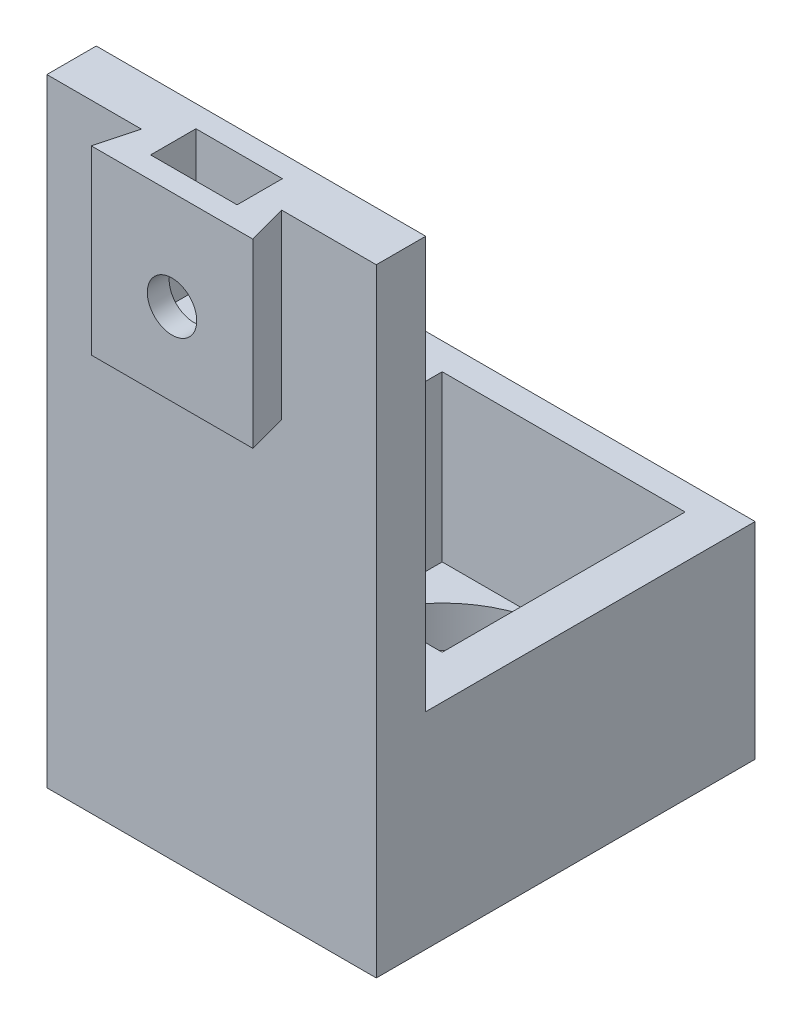
ISO-10303-21;
HEADER;
FILE_DESCRIPTION(('STEP AP214'),'2;1');
FILE_NAME('part.step','',(''),(''),'','','');
FILE_SCHEMA(('AUTOMOTIVE_DESIGN { 1 0 10303 214 1 1 1 1 }'));
ENDSEC;
DATA;
#1=APPLICATION_CONTEXT('core data for automotive mechanical design processes');
#2=APPLICATION_PROTOCOL_DEFINITION('international standard','automotive_design',2000,#1);
#3=PRODUCT_CONTEXT('',#1,'mechanical');
#4=PRODUCT('Part','Part','',(#3));
#5=PRODUCT_RELATED_PRODUCT_CATEGORY('part','',(#4));
#6=PRODUCT_DEFINITION_FORMATION('','',#4);
#7=PRODUCT_DEFINITION_CONTEXT('part definition',#1,'design');
#8=PRODUCT_DEFINITION('design','',#6,#7);
#9=PRODUCT_DEFINITION_SHAPE('','',#8);
#10=(LENGTH_UNIT() NAMED_UNIT(*) SI_UNIT(.MILLI.,.METRE.));
#11=(NAMED_UNIT(*) PLANE_ANGLE_UNIT() SI_UNIT($,.RADIAN.));
#12=(NAMED_UNIT(*) SI_UNIT($,.STERADIAN.) SOLID_ANGLE_UNIT());
#13=UNCERTAINTY_MEASURE_WITH_UNIT(LENGTH_MEASURE(1.E-05),#10,'distance_accuracy_value','');
#14=(GEOMETRIC_REPRESENTATION_CONTEXT(3) GLOBAL_UNCERTAINTY_ASSIGNED_CONTEXT((#13)) GLOBAL_UNIT_ASSIGNED_CONTEXT((#10,
#11,#12)) REPRESENTATION_CONTEXT('',''));
#15=CARTESIAN_POINT('',(0.,0.,0.));
#16=DIRECTION('',(0.,0.,1.));
#17=DIRECTION('',(1.,0.,0.));
#18=AXIS2_PLACEMENT_3D('',#15,#16,#17);
#19=CARTESIAN_POINT('',(0.,5.,0.));
#20=DIRECTION('',(0.,-1.,0.));
#21=DIRECTION('',(0.,0.,-1.));
#22=AXIS2_PLACEMENT_3D('',#19,#20,#21);
#23=PLANE('',#22);
#24=CARTESIAN_POINT('',(0.,5.,-22.));
#25=DIRECTION('',(0.,1.,0.));
#26=DIRECTION('',(0.,0.,1.));
#27=AXIS2_PLACEMENT_3D('',#24,#25,#26);
#28=CIRCLE('',#27,14.75);
#29=CARTESIAN_POINT('',(0.,5.,-7.25000000000001));
#30=VERTEX_POINT('',#29);
#31=CARTESIAN_POINT('',(14.75,5.,-22.));
#32=VERTEX_POINT('',#31);
#33=EDGE_CURVE('E171',#30,#32,#28,.T.);
#34=ORIENTED_EDGE('',*,*,#33,.F.);
#35=DIRECTION('',(1.,0.,0.));
#36=VECTOR('',#35,1.);
#37=CARTESIAN_POINT('',(-14.75,5.,-7.25));
#38=LINE('',#37,#36);
#39=CARTESIAN_POINT('',(14.75,5.,-7.25));
#40=VERTEX_POINT('',#39);
#41=EDGE_CURVE('E180',#30,#40,#38,.T.);
#42=ORIENTED_EDGE('',*,*,#41,.T.);
#43=DIRECTION('',(0.,0.,-1.));
#44=VECTOR('',#43,1.);
#45=CARTESIAN_POINT('',(14.75,5.,-7.25));
#46=LINE('',#45,#44);
#47=EDGE_CURVE('E183',#40,#32,#46,.T.);
#48=ORIENTED_EDGE('',*,*,#47,.T.);
#49=EDGE_LOOP('',(#34,#42,#48));
#50=FACE_BOUND('',#49,.T.);
#51=ADVANCED_FACE('F32',(#50),#23,.F.);
#52=CARTESIAN_POINT('',(0.,5.,-36.75));
#53=VERTEX_POINT('',#52);
#54=EDGE_CURVE('E185',#32,#53,#28,.T.);
#55=ORIENTED_EDGE('',*,*,#54,.F.);
#56=CARTESIAN_POINT('',(14.75,5.,-36.75));
#57=VERTEX_POINT('',#56);
#58=EDGE_CURVE('E196',#32,#57,#46,.T.);
#59=ORIENTED_EDGE('',*,*,#58,.T.);
#60=DIRECTION('',(-1.,0.,0.));
#61=VECTOR('',#60,1.);
#62=CARTESIAN_POINT('',(-14.75,5.,-36.75));
#63=LINE('',#62,#61);
#64=EDGE_CURVE('E201',#57,#53,#63,.T.);
#65=ORIENTED_EDGE('',*,*,#64,.T.);
#66=EDGE_LOOP('',(#55,#59,#65));
#67=FACE_BOUND('',#66,.T.);
#68=ADVANCED_FACE('F390',(#67),#23,.F.);
#69=CARTESIAN_POINT('',(-14.75,5.,-22.));
#70=VERTEX_POINT('',#69);
#71=EDGE_CURVE('E48',#53,#70,#28,.T.);
#72=ORIENTED_EDGE('',*,*,#71,.F.);
#73=CARTESIAN_POINT('',(-14.75,5.,-36.75));
#74=VERTEX_POINT('',#73);
#75=EDGE_CURVE('E200',#53,#74,#63,.T.);
#76=ORIENTED_EDGE('',*,*,#75,.T.);
#77=DIRECTION('',(0.,0.,1.));
#78=VECTOR('',#77,1.);
#79=CARTESIAN_POINT('',(-14.75,5.,-7.25));
#80=LINE('',#79,#78);
#81=EDGE_CURVE('E192',#74,#70,#80,.T.);
#82=ORIENTED_EDGE('',*,*,#81,.T.);
#83=EDGE_LOOP('',(#72,#76,#82));
#84=FACE_BOUND('',#83,.T.);
#85=ADVANCED_FACE('F395',(#84),#23,.F.);
#86=CARTESIAN_POINT('',(0.,0.,0.));
#87=DIRECTION('',(0.,0.,1.));
#88=DIRECTION('',(1.,0.,0.));
#89=AXIS2_PLACEMENT_3D('',#86,#87,#88);
#90=PLANE('',#89);
#91=CARTESIAN_POINT('',(0.,63.,0.));
#92=DIRECTION('',(0.,0.,1.));
#93=DIRECTION('',(1.,0.,0.));
#94=AXIS2_PLACEMENT_3D('',#91,#92,#93);
#95=CIRCLE('',#94,3.);
#96=CARTESIAN_POINT('',(3.00000000000001,63.,0.));
#97=VERTEX_POINT('',#96);
#98=EDGE_CURVE('E240',#97,#97,#95,.T.);
#99=ORIENTED_EDGE('',*,*,#98,.T.);
#100=EDGE_LOOP('',(#99));
#101=FACE_BOUND('',#100,.T.);
#102=DIRECTION('',(1.,0.,0.));
#103=VECTOR('',#102,1.);
#104=CARTESIAN_POINT('',(20.,25.,0.));
#105=LINE('',#104,#103);
#106=CARTESIAN_POINT('',(-20.,25.,0.));
#107=VERTEX_POINT('',#106);
#108=CARTESIAN_POINT('',(20.,25.,0.));
#109=VERTEX_POINT('',#108);
#110=EDGE_CURVE('E216',#107,#109,#105,.T.);
#111=ORIENTED_EDGE('',*,*,#110,.F.);
#112=DIRECTION('',(0.,-1.,0.));
#113=VECTOR('',#112,1.);
#114=CARTESIAN_POINT('',(-20.,0.,0.));
#115=LINE('',#114,#113);
#116=CARTESIAN_POINT('',(-20.,75.,0.));
#117=VERTEX_POINT('',#116);
#118=EDGE_CURVE('E315',#117,#107,#115,.T.);
#119=ORIENTED_EDGE('',*,*,#118,.F.);
#120=DIRECTION('',(-1.,0.,0.));
#121=VECTOR('',#120,1.);
#122=CARTESIAN_POINT('',(20.,75.,0.));
#123=LINE('',#122,#121);
#124=CARTESIAN_POINT('',(20.,75.,0.));
#125=VERTEX_POINT('',#124);
#126=EDGE_CURVE('E325',#125,#117,#123,.T.);
#127=ORIENTED_EDGE('',*,*,#126,.F.);
#128=DIRECTION('',(0.,1.,0.));
#129=VECTOR('',#128,1.);
#130=CARTESIAN_POINT('',(20.,0.,0.));
#131=LINE('',#130,#129);
#132=EDGE_CURVE('E304',#109,#125,#131,.T.);
#133=ORIENTED_EDGE('',*,*,#132,.F.);
#134=EDGE_LOOP('',(#111,#119,#127,#133));
#135=FACE_BOUND('',#134,.T.);
#136=ADVANCED_FACE('F344',(#101,#135),#90,.F.);
#137=CARTESIAN_POINT('',(20.,0.,6.));
#138=DIRECTION('',(-1.,0.,0.));
#139=DIRECTION('',(0.,0.,1.));
#140=AXIS2_PLACEMENT_3D('',#137,#138,#139);
#141=PLANE('',#140);
#142=DIRECTION('',(0.,0.,-1.));
#143=VECTOR('',#142,1.);
#144=CARTESIAN_POINT('',(20.,0.,6.));
#145=LINE('',#144,#143);
#146=CARTESIAN_POINT('',(20.,0.,6.));
#147=VERTEX_POINT('',#146);
#148=CARTESIAN_POINT('',(20.,0.,-40.));
#149=VERTEX_POINT('',#148);
#150=EDGE_CURVE('E323',#147,#149,#145,.T.);
#151=ORIENTED_EDGE('',*,*,#150,.T.);
#152=DIRECTION('',(0.,-1.,0.));
#153=VECTOR('',#152,1.);
#154=CARTESIAN_POINT('',(20.,0.,-40.));
#155=LINE('',#154,#153);
#156=CARTESIAN_POINT('',(20.,25.,-40.));
#157=VERTEX_POINT('',#156);
#158=EDGE_CURVE('E221',#157,#149,#155,.T.);
#159=ORIENTED_EDGE('',*,*,#158,.F.);
#160=DIRECTION('',(0.,0.,1.));
#161=VECTOR('',#160,1.);
#162=CARTESIAN_POINT('',(20.,25.,-40.));
#163=LINE('',#162,#161);
#164=EDGE_CURVE('E231',#157,#109,#163,.T.);
#165=ORIENTED_EDGE('',*,*,#164,.T.);
#166=ORIENTED_EDGE('',*,*,#132,.T.);
#167=DIRECTION('',(0.,0.,-1.));
#168=VECTOR('',#167,1.);
#169=CARTESIAN_POINT('',(20.,75.,6.));
#170=LINE('',#169,#168);
#171=CARTESIAN_POINT('',(20.,75.,6.));
#172=VERTEX_POINT('',#171);
#173=EDGE_CURVE('E11',#172,#125,#170,.T.);
#174=ORIENTED_EDGE('',*,*,#173,.F.);
#175=DIRECTION('',(0.,1.,0.));
#176=VECTOR('',#175,1.);
#177=CARTESIAN_POINT('',(20.,0.,6.));
#178=LINE('',#177,#176);
#179=EDGE_CURVE('E311',#147,#172,#178,.T.);
#180=ORIENTED_EDGE('',*,*,#179,.F.);
#181=EDGE_LOOP('',(#151,#159,#165,#166,#174,#180));
#182=FACE_BOUND('',#181,.T.);
#183=ADVANCED_FACE('F34',(#182),#141,.F.);
#184=CARTESIAN_POINT('',(20.,75.,6.));
#185=DIRECTION('',(0.,-1.,0.));
#186=DIRECTION('',(0.,0.,-1.));
#187=AXIS2_PLACEMENT_3D('',#184,#185,#186);
#188=PLANE('',#187);
#189=DIRECTION('',(1.,0.,0.));
#190=VECTOR('',#189,1.);
#191=CARTESIAN_POINT('',(-5.25,75.,8.15));
#192=LINE('',#191,#190);
#193=CARTESIAN_POINT('',(-5.25,75.,8.15));
#194=VERTEX_POINT('',#193);
#195=CARTESIAN_POINT('',(5.25,75.,8.15));
#196=VERTEX_POINT('',#195);
#197=EDGE_CURVE('E264',#194,#196,#192,.T.);
#198=ORIENTED_EDGE('',*,*,#197,.F.);
#199=DIRECTION('',(0.,0.,1.));
#200=VECTOR('',#199,1.);
#201=CARTESIAN_POINT('',(-5.25,75.,2.65));
#202=LINE('',#201,#200);
#203=CARTESIAN_POINT('',(-5.25,75.,2.65));
#204=VERTEX_POINT('',#203);
#205=EDGE_CURVE('E248',#204,#194,#202,.T.);
#206=ORIENTED_EDGE('',*,*,#205,.F.);
#207=DIRECTION('',(-1.,0.,0.));
#208=VECTOR('',#207,1.);
#209=CARTESIAN_POINT('',(-5.25,75.,2.65));
#210=LINE('',#209,#208);
#211=CARTESIAN_POINT('',(5.25,75.,2.65));
#212=VERTEX_POINT('',#211);
#213=EDGE_CURVE('E253',#212,#204,#210,.T.);
#214=ORIENTED_EDGE('',*,*,#213,.F.);
#215=DIRECTION('',(0.,0.,-1.));
#216=VECTOR('',#215,1.);
#217=CARTESIAN_POINT('',(5.25,75.,2.65));
#218=LINE('',#217,#216);
#219=EDGE_CURVE('E267',#196,#212,#218,.T.);
#220=ORIENTED_EDGE('',*,*,#219,.F.);
#221=EDGE_LOOP('',(#198,#206,#214,#220));
#222=FACE_BOUND('',#221,.T.);
#223=ORIENTED_EDGE('',*,*,#126,.T.);
#224=DIRECTION('',(0.,0.,-1.));
#225=VECTOR('',#224,1.);
#226=CARTESIAN_POINT('',(-20.,75.,6.));
#227=LINE('',#226,#225);
#228=CARTESIAN_POINT('',(-20.,75.,6.));
#229=VERTEX_POINT('',#228);
#230=EDGE_CURVE('E41',#229,#117,#227,.T.);
#231=ORIENTED_EDGE('',*,*,#230,.F.);
#232=DIRECTION('',(-1.,0.,0.));
#233=VECTOR('',#232,1.);
#234=CARTESIAN_POINT('',(20.,75.,6.));
#235=LINE('',#234,#233);
#236=CARTESIAN_POINT('',(-8.51384387633063,75.,6.));
#237=VERTEX_POINT('',#236);
#238=EDGE_CURVE('E314',#237,#229,#235,.T.);
#239=ORIENTED_EDGE('',*,*,#238,.F.);
#240=DIRECTION('',(-0.258819045102517,0.,0.965925826289069));
#241=VECTOR('',#240,1.);
#242=CARTESIAN_POINT('',(-8.51384387633063,75.,6.));
#243=LINE('',#242,#241);
#244=CARTESIAN_POINT('',(-9.8,75.,10.8));
#245=VERTEX_POINT('',#244);
#246=EDGE_CURVE('E297',#237,#245,#243,.T.);
#247=ORIENTED_EDGE('',*,*,#246,.T.);
#248=DIRECTION('',(1.,0.,0.));
#249=VECTOR('',#248,1.);
#250=CARTESIAN_POINT('',(-9.8,75.,10.8));
#251=LINE('',#250,#249);
#252=CARTESIAN_POINT('',(9.8,75.,10.8));
#253=VERTEX_POINT('',#252);
#254=EDGE_CURVE('E285',#245,#253,#251,.T.);
#255=ORIENTED_EDGE('',*,*,#254,.T.);
#256=DIRECTION('',(-0.258819045102517,0.,-0.965925826289069));
#257=VECTOR('',#256,1.);
#258=CARTESIAN_POINT('',(8.51384387633063,75.,5.99999999999999));
#259=LINE('',#258,#257);
#260=CARTESIAN_POINT('',(8.51384387633063,75.,5.99999999999999));
#261=VERTEX_POINT('',#260);
#262=EDGE_CURVE('E274',#253,#261,#259,.T.);
#263=ORIENTED_EDGE('',*,*,#262,.T.);
#264=EDGE_CURVE('E316',#172,#261,#235,.T.);
#265=ORIENTED_EDGE('',*,*,#264,.F.);
#266=ORIENTED_EDGE('',*,*,#173,.T.);
#267=EDGE_LOOP('',(#223,#231,#239,#247,#255,#263,#265,#266));
#268=FACE_BOUND('',#267,.T.);
#269=ADVANCED_FACE('F364',(#222,#268),#188,.F.);
#270=CARTESIAN_POINT('',(-20.,0.,6.));
#271=DIRECTION('',(1.,0.,0.));
#272=DIRECTION('',(0.,1.,0.));
#273=AXIS2_PLACEMENT_3D('',#270,#271,#272);
#274=PLANE('',#273);
#275=ORIENTED_EDGE('',*,*,#118,.T.);
#276=DIRECTION('',(0.,0.,1.));
#277=VECTOR('',#276,1.);
#278=CARTESIAN_POINT('',(-20.,25.,-40.));
#279=LINE('',#278,#277);
#280=CARTESIAN_POINT('',(-20.,25.,-40.));
#281=VERTEX_POINT('',#280);
#282=EDGE_CURVE('E236',#281,#107,#279,.T.);
#283=ORIENTED_EDGE('',*,*,#282,.F.);
#284=DIRECTION('',(0.,1.,0.));
#285=VECTOR('',#284,1.);
#286=CARTESIAN_POINT('',(-20.,0.,-40.));
#287=LINE('',#286,#285);
#288=CARTESIAN_POINT('',(-20.,0.,-40.));
#289=VERTEX_POINT('',#288);
#290=EDGE_CURVE('E227',#289,#281,#287,.T.);
#291=ORIENTED_EDGE('',*,*,#290,.F.);
#292=DIRECTION('',(0.,0.,-1.));
#293=VECTOR('',#292,1.);
#294=CARTESIAN_POINT('',(-20.,0.,6.));
#295=LINE('',#294,#293);
#296=CARTESIAN_POINT('',(-20.,0.,6.));
#297=VERTEX_POINT('',#296);
#298=EDGE_CURVE('E330',#297,#289,#295,.T.);
#299=ORIENTED_EDGE('',*,*,#298,.F.);
#300=DIRECTION('',(0.,-1.,0.));
#301=VECTOR('',#300,1.);
#302=CARTESIAN_POINT('',(-20.,0.,6.));
#303=LINE('',#302,#301);
#304=EDGE_CURVE('E319',#229,#297,#303,.T.);
#305=ORIENTED_EDGE('',*,*,#304,.F.);
#306=ORIENTED_EDGE('',*,*,#230,.T.);
#307=EDGE_LOOP('',(#275,#283,#291,#299,#305,#306));
#308=FACE_BOUND('',#307,.T.);
#309=ADVANCED_FACE('F337',(#308),#274,.F.);
#310=CARTESIAN_POINT('',(-20.,0.,6.));
#311=DIRECTION('',(0.,1.,0.));
#312=DIRECTION('',(-1.,0.,0.));
#313=AXIS2_PLACEMENT_3D('',#310,#311,#312);
#314=PLANE('',#313);
#315=CARTESIAN_POINT('',(0.,0.,-22.));
#316=DIRECTION('',(0.,1.,0.));
#317=DIRECTION('',(0.,0.,1.));
#318=AXIS2_PLACEMENT_3D('',#315,#316,#317);
#319=CIRCLE('',#318,14.75);
#320=CARTESIAN_POINT('',(0.,0.,-7.25000000000001));
#321=VERTEX_POINT('',#320);
#322=EDGE_CURVE('E184',#321,#321,#319,.T.);
#323=ORIENTED_EDGE('',*,*,#322,.T.);
#324=EDGE_LOOP('',(#323));
#325=FACE_BOUND('',#324,.T.);
#326=ORIENTED_EDGE('',*,*,#298,.T.);
#327=DIRECTION('',(-1.,0.,0.));
#328=VECTOR('',#327,1.);
#329=CARTESIAN_POINT('',(20.,0.,-40.));
#330=LINE('',#329,#328);
#331=EDGE_CURVE('E224',#149,#289,#330,.T.);
#332=ORIENTED_EDGE('',*,*,#331,.F.);
#333=ORIENTED_EDGE('',*,*,#150,.F.);
#334=DIRECTION('',(1.,0.,0.));
#335=VECTOR('',#334,1.);
#336=CARTESIAN_POINT('',(-20.,0.,6.));
#337=LINE('',#336,#335);
#338=EDGE_CURVE('E321',#297,#147,#337,.T.);
#339=ORIENTED_EDGE('',*,*,#338,.F.);
#340=EDGE_LOOP('',(#326,#332,#333,#339));
#341=FACE_BOUND('',#340,.T.);
#342=ADVANCED_FACE('F360',(#325,#341),#314,.F.);
#343=CARTESIAN_POINT('',(0.,0.,6.));
#344=DIRECTION('',(0.,0.,1.));
#345=DIRECTION('',(1.,0.,0.));
#346=AXIS2_PLACEMENT_3D('',#343,#344,#345);
#347=PLANE('',#346);
#348=DIRECTION('',(0.,1.,0.));
#349=VECTOR('',#348,1.);
#350=CARTESIAN_POINT('',(8.51384387633063,53.,5.99999999999999));
#351=LINE('',#350,#349);
#352=CARTESIAN_POINT('',(8.51384387633063,53.,5.99999999999999));
#353=VERTEX_POINT('',#352);
#354=EDGE_CURVE('E294',#353,#261,#351,.T.);
#355=ORIENTED_EDGE('',*,*,#354,.F.);
#356=DIRECTION('',(-1.,0.,0.));
#357=VECTOR('',#356,1.);
#358=CARTESIAN_POINT('',(8.51384387633063,53.,5.99999999999999));
#359=LINE('',#358,#357);
#360=CARTESIAN_POINT('',(-8.51384387633063,53.,6.));
#361=VERTEX_POINT('',#360);
#362=EDGE_CURVE('E284',#353,#361,#359,.T.);
#363=ORIENTED_EDGE('',*,*,#362,.T.);
#364=DIRECTION('',(0.,1.,0.));
#365=VECTOR('',#364,1.);
#366=CARTESIAN_POINT('',(-8.51384387633063,53.,6.));
#367=LINE('',#366,#365);
#368=EDGE_CURVE('E307',#361,#237,#367,.T.);
#369=ORIENTED_EDGE('',*,*,#368,.T.);
#370=ORIENTED_EDGE('',*,*,#238,.T.);
#371=ORIENTED_EDGE('',*,*,#304,.T.);
#372=ORIENTED_EDGE('',*,*,#338,.T.);
#373=ORIENTED_EDGE('',*,*,#179,.T.);
#374=ORIENTED_EDGE('',*,*,#264,.T.);
#375=EDGE_LOOP('',(#355,#363,#369,#370,#371,#372,#373,#374));
#376=FACE_BOUND('',#375,.T.);
#377=ADVANCED_FACE('F363',(#376),#347,.T.);
#378=CARTESIAN_POINT('',(8.51384387633063,53.,5.99999999999999));
#379=DIRECTION('',(0.965925826289069,0.,-0.258819045102517));
#380=DIRECTION('',(-0.258819045102517,0.,-0.965925826289069));
#381=AXIS2_PLACEMENT_3D('',#378,#379,#380);
#382=PLANE('',#381);
#383=ORIENTED_EDGE('',*,*,#262,.F.);
#384=DIRECTION('',(0.,1.,0.));
#385=VECTOR('',#384,1.);
#386=CARTESIAN_POINT('',(9.8,53.,10.8));
#387=LINE('',#386,#385);
#388=CARTESIAN_POINT('',(9.8,53.,10.8));
#389=VERTEX_POINT('',#388);
#390=EDGE_CURVE('E302',#389,#253,#387,.T.);
#391=ORIENTED_EDGE('',*,*,#390,.F.);
#392=DIRECTION('',(-0.258819045102517,0.,-0.965925826289069));
#393=VECTOR('',#392,1.);
#394=CARTESIAN_POINT('',(8.51384387633063,53.,5.99999999999999));
#395=LINE('',#394,#393);
#396=EDGE_CURVE('E281',#389,#353,#395,.T.);
#397=ORIENTED_EDGE('',*,*,#396,.T.);
#398=ORIENTED_EDGE('',*,*,#354,.T.);
#399=EDGE_LOOP('',(#383,#391,#397,#398));
#400=FACE_BOUND('',#399,.T.);
#401=ADVANCED_FACE('F373',(#400),#382,.T.);
#402=CARTESIAN_POINT('',(-9.8,53.,10.8));
#403=DIRECTION('',(0.,0.,1.));
#404=DIRECTION('',(1.,0.,0.));
#405=AXIS2_PLACEMENT_3D('',#402,#403,#404);
#406=PLANE('',#405);
#407=CARTESIAN_POINT('',(0.,63.,10.8));
#408=DIRECTION('',(0.,0.,1.));
#409=DIRECTION('',(1.,0.,0.));
#410=AXIS2_PLACEMENT_3D('',#407,#408,#409);
#411=CIRCLE('',#410,3.);
#412=CARTESIAN_POINT('',(3.00000000000001,63.,10.8));
#413=VERTEX_POINT('',#412);
#414=EDGE_CURVE('E239',#413,#413,#411,.T.);
#415=ORIENTED_EDGE('',*,*,#414,.F.);
#416=EDGE_LOOP('',(#415));
#417=FACE_BOUND('',#416,.T.);
#418=ORIENTED_EDGE('',*,*,#254,.F.);
#419=DIRECTION('',(0.,1.,0.));
#420=VECTOR('',#419,1.);
#421=CARTESIAN_POINT('',(-9.8,53.,10.8));
#422=LINE('',#421,#420);
#423=CARTESIAN_POINT('',(-9.8,53.,10.8));
#424=VERTEX_POINT('',#423);
#425=EDGE_CURVE('E305',#424,#245,#422,.T.);
#426=ORIENTED_EDGE('',*,*,#425,.F.);
#427=DIRECTION('',(1.,0.,0.));
#428=VECTOR('',#427,1.);
#429=CARTESIAN_POINT('',(-9.8,53.,10.8));
#430=LINE('',#429,#428);
#431=EDGE_CURVE('E291',#424,#389,#430,.T.);
#432=ORIENTED_EDGE('',*,*,#431,.T.);
#433=ORIENTED_EDGE('',*,*,#390,.T.);
#434=EDGE_LOOP('',(#418,#426,#432,#433));
#435=FACE_BOUND('',#434,.T.);
#436=ADVANCED_FACE('F368',(#417,#435),#406,.T.);
#437=CARTESIAN_POINT('',(-8.51384387633063,53.,6.));
#438=DIRECTION('',(-0.965925826289069,0.,-0.258819045102517));
#439=DIRECTION('',(-0.258819045102517,0.,0.965925826289069));
#440=AXIS2_PLACEMENT_3D('',#437,#438,#439);
#441=PLANE('',#440);
#442=ORIENTED_EDGE('',*,*,#246,.F.);
#443=ORIENTED_EDGE('',*,*,#368,.F.);
#444=DIRECTION('',(-0.258819045102517,0.,0.965925826289069));
#445=VECTOR('',#444,1.);
#446=CARTESIAN_POINT('',(-8.51384387633063,53.,6.));
#447=LINE('',#446,#445);
#448=EDGE_CURVE('E288',#361,#424,#447,.T.);
#449=ORIENTED_EDGE('',*,*,#448,.T.);
#450=ORIENTED_EDGE('',*,*,#425,.T.);
#451=EDGE_LOOP('',(#442,#443,#449,#450));
#452=FACE_BOUND('',#451,.T.);
#453=ADVANCED_FACE('F377',(#452),#441,.T.);
#454=CARTESIAN_POINT('',(0.,53.,0.));
#455=DIRECTION('',(0.,1.,0.));
#456=DIRECTION('',(0.,0.,1.));
#457=AXIS2_PLACEMENT_3D('',#454,#455,#456);
#458=PLANE('',#457);
#459=ORIENTED_EDGE('',*,*,#396,.F.);
#460=ORIENTED_EDGE('',*,*,#431,.F.);
#461=ORIENTED_EDGE('',*,*,#448,.F.);
#462=ORIENTED_EDGE('',*,*,#362,.F.);
#463=EDGE_LOOP('',(#459,#460,#461,#462));
#464=FACE_BOUND('',#463,.T.);
#465=ADVANCED_FACE('F376',(#464),#458,.F.);
#466=CARTESIAN_POINT('',(-5.25,58.,2.65));
#467=DIRECTION('',(-1.,0.,0.));
#468=DIRECTION('',(0.,0.,1.));
#469=AXIS2_PLACEMENT_3D('',#466,#467,#468);
#470=PLANE('',#469);
#471=ORIENTED_EDGE('',*,*,#205,.T.);
#472=DIRECTION('',(0.,1.,0.));
#473=VECTOR('',#472,1.);
#474=CARTESIAN_POINT('',(-5.25,58.,8.15));
#475=LINE('',#474,#473);
#476=CARTESIAN_POINT('',(-5.25,58.,8.15));
#477=VERTEX_POINT('',#476);
#478=EDGE_CURVE('E262',#477,#194,#475,.T.);
#479=ORIENTED_EDGE('',*,*,#478,.F.);
#480=DIRECTION('',(0.,0.,1.));
#481=VECTOR('',#480,1.);
#482=CARTESIAN_POINT('',(-5.25,58.,2.65));
#483=LINE('',#482,#481);
#484=CARTESIAN_POINT('',(-5.25,58.,2.65));
#485=VERTEX_POINT('',#484);
#486=EDGE_CURVE('E249',#485,#477,#483,.T.);
#487=ORIENTED_EDGE('',*,*,#486,.F.);
#488=DIRECTION('',(0.,1.,0.));
#489=VECTOR('',#488,1.);
#490=CARTESIAN_POINT('',(-5.25,58.,2.65));
#491=LINE('',#490,#489);
#492=EDGE_CURVE('E272',#485,#204,#491,.T.);
#493=ORIENTED_EDGE('',*,*,#492,.T.);
#494=EDGE_LOOP('',(#471,#479,#487,#493));
#495=FACE_BOUND('',#494,.T.);
#496=ADVANCED_FACE('F384',(#495),#470,.F.);
#497=CARTESIAN_POINT('',(-5.25,58.,2.65));
#498=DIRECTION('',(0.,0.,-1.));
#499=DIRECTION('',(-1.,0.,0.));
#500=AXIS2_PLACEMENT_3D('',#497,#498,#499);
#501=PLANE('',#500);
#502=CARTESIAN_POINT('',(0.,63.,2.65));
#503=DIRECTION('',(0.,0.,-1.));
#504=DIRECTION('',(-1.,0.,0.));
#505=AXIS2_PLACEMENT_3D('',#502,#503,#504);
#506=CIRCLE('',#505,3.);
#507=CARTESIAN_POINT('',(-2.99999999999999,63.,2.65));
#508=VERTEX_POINT('',#507);
#509=EDGE_CURVE('E245',#508,#508,#506,.T.);
#510=ORIENTED_EDGE('',*,*,#509,.T.);
#511=EDGE_LOOP('',(#510));
#512=FACE_BOUND('',#511,.T.);
#513=ORIENTED_EDGE('',*,*,#213,.T.);
#514=ORIENTED_EDGE('',*,*,#492,.F.);
#515=DIRECTION('',(-1.,0.,0.));
#516=VECTOR('',#515,1.);
#517=CARTESIAN_POINT('',(-5.25,58.,2.65));
#518=LINE('',#517,#516);
#519=CARTESIAN_POINT('',(5.25,58.,2.65));
#520=VERTEX_POINT('',#519);
#521=EDGE_CURVE('E259',#520,#485,#518,.T.);
#522=ORIENTED_EDGE('',*,*,#521,.F.);
#523=DIRECTION('',(0.,1.,0.));
#524=VECTOR('',#523,1.);
#525=CARTESIAN_POINT('',(5.25,58.,2.65));
#526=LINE('',#525,#524);
#527=EDGE_CURVE('E275',#520,#212,#526,.T.);
#528=ORIENTED_EDGE('',*,*,#527,.T.);
#529=EDGE_LOOP('',(#513,#514,#522,#528));
#530=FACE_BOUND('',#529,.T.);
#531=ADVANCED_FACE('F450',(#512,#530),#501,.F.);
#532=CARTESIAN_POINT('',(5.25,58.,2.65));
#533=DIRECTION('',(1.,0.,0.));
#534=DIRECTION('',(0.,0.,-1.));
#535=AXIS2_PLACEMENT_3D('',#532,#533,#534);
#536=PLANE('',#535);
#537=ORIENTED_EDGE('',*,*,#219,.T.);
#538=ORIENTED_EDGE('',*,*,#527,.F.);
#539=DIRECTION('',(0.,0.,-1.));
#540=VECTOR('',#539,1.);
#541=CARTESIAN_POINT('',(5.25,58.,2.65));
#542=LINE('',#541,#540);
#543=CARTESIAN_POINT('',(5.25,58.,8.15));
#544=VERTEX_POINT('',#543);
#545=EDGE_CURVE('E256',#544,#520,#542,.T.);
#546=ORIENTED_EDGE('',*,*,#545,.F.);
#547=DIRECTION('',(0.,1.,0.));
#548=VECTOR('',#547,1.);
#549=CARTESIAN_POINT('',(5.25,58.,8.15));
#550=LINE('',#549,#548);
#551=EDGE_CURVE('E277',#544,#196,#550,.T.);
#552=ORIENTED_EDGE('',*,*,#551,.T.);
#553=EDGE_LOOP('',(#537,#538,#546,#552));
#554=FACE_BOUND('',#553,.T.);
#555=ADVANCED_FACE('F453',(#554),#536,.F.);
#556=CARTESIAN_POINT('',(-5.25,58.,8.15));
#557=DIRECTION('',(0.,0.,1.));
#558=DIRECTION('',(1.,0.,0.));
#559=AXIS2_PLACEMENT_3D('',#556,#557,#558);
#560=PLANE('',#559);
#561=CARTESIAN_POINT('',(0.,63.,8.15));
#562=DIRECTION('',(0.,0.,1.));
#563=DIRECTION('',(1.,0.,0.));
#564=AXIS2_PLACEMENT_3D('',#561,#562,#563);
#565=CIRCLE('',#564,3.);
#566=CARTESIAN_POINT('',(3.00000000000001,63.,8.15));
#567=VERTEX_POINT('',#566);
#568=EDGE_CURVE('E36',#567,#567,#565,.T.);
#569=ORIENTED_EDGE('',*,*,#568,.T.);
#570=EDGE_LOOP('',(#569));
#571=FACE_BOUND('',#570,.T.);
#572=ORIENTED_EDGE('',*,*,#197,.T.);
#573=ORIENTED_EDGE('',*,*,#551,.F.);
#574=DIRECTION('',(1.,0.,0.));
#575=VECTOR('',#574,1.);
#576=CARTESIAN_POINT('',(-5.25,58.,8.15));
#577=LINE('',#576,#575);
#578=EDGE_CURVE('E252',#477,#544,#577,.T.);
#579=ORIENTED_EDGE('',*,*,#578,.F.);
#580=ORIENTED_EDGE('',*,*,#478,.T.);
#581=EDGE_LOOP('',(#572,#573,#579,#580));
#582=FACE_BOUND('',#581,.T.);
#583=ADVANCED_FACE('F448',(#571,#582),#560,.F.);
#584=CARTESIAN_POINT('',(0.,58.,0.));
#585=DIRECTION('',(0.,1.,0.));
#586=DIRECTION('',(0.,0.,1.));
#587=AXIS2_PLACEMENT_3D('',#584,#585,#586);
#588=PLANE('',#587);
#589=ORIENTED_EDGE('',*,*,#486,.T.);
#590=ORIENTED_EDGE('',*,*,#578,.T.);
#591=ORIENTED_EDGE('',*,*,#545,.T.);
#592=ORIENTED_EDGE('',*,*,#521,.T.);
#593=EDGE_LOOP('',(#589,#590,#591,#592));
#594=FACE_BOUND('',#593,.T.);
#595=ADVANCED_FACE('F445',(#594),#588,.T.);
#596=CARTESIAN_POINT('',(0.,63.,0.));
#597=DIRECTION('',(0.,0.,1.));
#598=DIRECTION('',(1.,0.,0.));
#599=AXIS2_PLACEMENT_3D('',#596,#597,#598);
#600=CYLINDRICAL_SURFACE('',#599,3.);
#601=ORIENTED_EDGE('',*,*,#414,.T.);
#602=EDGE_LOOP('',(#601));
#603=FACE_BOUND('',#602,.T.);
#604=ORIENTED_EDGE('',*,*,#568,.F.);
#605=EDGE_LOOP('',(#604));
#606=FACE_BOUND('',#605,.T.);
#607=ADVANCED_FACE('F443',(#603,#606),#600,.F.);
#608=ORIENTED_EDGE('',*,*,#98,.F.);
#609=EDGE_LOOP('',(#608));
#610=FACE_BOUND('',#609,.T.);
#611=ORIENTED_EDGE('',*,*,#509,.F.);
#612=EDGE_LOOP('',(#611));
#613=FACE_BOUND('',#612,.T.);
#614=ADVANCED_FACE('F440',(#610,#613),#600,.F.);
#615=CARTESIAN_POINT('',(20.,25.,-40.));
#616=DIRECTION('',(0.,-1.,0.));
#617=DIRECTION('',(0.,0.,-1.));
#618=AXIS2_PLACEMENT_3D('',#615,#616,#617);
#619=PLANE('',#618);
#620=DIRECTION('',(1.,0.,0.));
#621=VECTOR('',#620,1.);
#622=CARTESIAN_POINT('',(-14.75,25.,-7.25));
#623=LINE('',#622,#621);
#624=CARTESIAN_POINT('',(-14.75,25.,-7.25));
#625=VERTEX_POINT('',#624);
#626=CARTESIAN_POINT('',(14.75,25.,-7.25));
#627=VERTEX_POINT('',#626);
#628=EDGE_CURVE('E206',#625,#627,#623,.T.);
#629=ORIENTED_EDGE('',*,*,#628,.F.);
#630=DIRECTION('',(0.,0.,1.));
#631=VECTOR('',#630,1.);
#632=CARTESIAN_POINT('',(-14.75,25.,-7.25));
#633=LINE('',#632,#631);
#634=CARTESIAN_POINT('',(-14.75,25.,-36.75));
#635=VERTEX_POINT('',#634);
#636=EDGE_CURVE('E56',#635,#625,#633,.T.);
#637=ORIENTED_EDGE('',*,*,#636,.F.);
#638=DIRECTION('',(-1.,0.,0.));
#639=VECTOR('',#638,1.);
#640=CARTESIAN_POINT('',(-14.75,25.,-36.75));
#641=LINE('',#640,#639);
#642=CARTESIAN_POINT('',(14.75,25.,-36.75));
#643=VERTEX_POINT('',#642);
#644=EDGE_CURVE('E211',#643,#635,#641,.T.);
#645=ORIENTED_EDGE('',*,*,#644,.F.);
#646=DIRECTION('',(0.,0.,-1.));
#647=VECTOR('',#646,1.);
#648=CARTESIAN_POINT('',(14.75,25.,-7.25));
#649=LINE('',#648,#647);
#650=EDGE_CURVE('E208',#627,#643,#649,.T.);
#651=ORIENTED_EDGE('',*,*,#650,.F.);
#652=EDGE_LOOP('',(#629,#637,#645,#651));
#653=FACE_BOUND('',#652,.T.);
#654=ORIENTED_EDGE('',*,*,#110,.T.);
#655=ORIENTED_EDGE('',*,*,#164,.F.);
#656=DIRECTION('',(1.,0.,0.));
#657=VECTOR('',#656,1.);
#658=CARTESIAN_POINT('',(20.,25.,-40.));
#659=LINE('',#658,#657);
#660=EDGE_CURVE('E229',#281,#157,#659,.T.);
#661=ORIENTED_EDGE('',*,*,#660,.F.);
#662=ORIENTED_EDGE('',*,*,#282,.T.);
#663=EDGE_LOOP('',(#654,#655,#661,#662));
#664=FACE_BOUND('',#663,.T.);
#665=ADVANCED_FACE('F347',(#653,#664),#619,.F.);
#666=CARTESIAN_POINT('',(0.,0.,-40.));
#667=DIRECTION('',(0.,0.,1.));
#668=DIRECTION('',(1.,0.,0.));
#669=AXIS2_PLACEMENT_3D('',#666,#667,#668);
#670=PLANE('',#669);
#671=ORIENTED_EDGE('',*,*,#158,.T.);
#672=ORIENTED_EDGE('',*,*,#331,.T.);
#673=ORIENTED_EDGE('',*,*,#290,.T.);
#674=ORIENTED_EDGE('',*,*,#660,.T.);
#675=EDGE_LOOP('',(#671,#672,#673,#674));
#676=FACE_BOUND('',#675,.T.);
#677=ADVANCED_FACE('F356',(#676),#670,.F.);
#678=CARTESIAN_POINT('',(-14.75,5.,-7.25));
#679=DIRECTION('',(-1.,0.,0.));
#680=DIRECTION('',(0.,0.,1.));
#681=AXIS2_PLACEMENT_3D('',#678,#679,#680);
#682=PLANE('',#681);
#683=ORIENTED_EDGE('',*,*,#636,.T.);
#684=DIRECTION('',(0.,1.,0.));
#685=VECTOR('',#684,1.);
#686=CARTESIAN_POINT('',(-14.75,5.,-7.25));
#687=LINE('',#686,#685);
#688=CARTESIAN_POINT('',(-14.75,5.,-7.25));
#689=VERTEX_POINT('',#688);
#690=EDGE_CURVE('E204',#689,#625,#687,.T.);
#691=ORIENTED_EDGE('',*,*,#690,.F.);
#692=EDGE_CURVE('E195',#70,#689,#80,.T.);
#693=ORIENTED_EDGE('',*,*,#692,.F.);
#694=ORIENTED_EDGE('',*,*,#81,.F.);
#695=DIRECTION('',(0.,1.,0.));
#696=VECTOR('',#695,1.);
#697=CARTESIAN_POINT('',(-14.75,5.,-36.75));
#698=LINE('',#697,#696);
#699=EDGE_CURVE('E214',#74,#635,#698,.T.);
#700=ORIENTED_EDGE('',*,*,#699,.T.);
#701=EDGE_LOOP('',(#683,#691,#693,#694,#700));
#702=FACE_BOUND('',#701,.T.);
#703=ADVANCED_FACE('F428',(#702),#682,.F.);
#704=CARTESIAN_POINT('',(-14.75,5.,-36.75));
#705=DIRECTION('',(0.,0.,-1.));
#706=DIRECTION('',(-1.,0.,0.));
#707=AXIS2_PLACEMENT_3D('',#704,#705,#706);
#708=PLANE('',#707);
#709=ORIENTED_EDGE('',*,*,#644,.T.);
#710=ORIENTED_EDGE('',*,*,#699,.F.);
#711=ORIENTED_EDGE('',*,*,#75,.F.);
#712=ORIENTED_EDGE('',*,*,#64,.F.);
#713=DIRECTION('',(0.,1.,0.));
#714=VECTOR('',#713,1.);
#715=CARTESIAN_POINT('',(14.75,5.,-36.75));
#716=LINE('',#715,#714);
#717=EDGE_CURVE('E217',#57,#643,#716,.T.);
#718=ORIENTED_EDGE('',*,*,#717,.T.);
#719=EDGE_LOOP('',(#709,#710,#711,#712,#718));
#720=FACE_BOUND('',#719,.T.);
#721=ADVANCED_FACE('F420',(#720),#708,.F.);
#722=CARTESIAN_POINT('',(14.75,5.,-7.25));
#723=DIRECTION('',(1.,0.,0.));
#724=DIRECTION('',(0.,0.,-1.));
#725=AXIS2_PLACEMENT_3D('',#722,#723,#724);
#726=PLANE('',#725);
#727=ORIENTED_EDGE('',*,*,#650,.T.);
#728=ORIENTED_EDGE('',*,*,#717,.F.);
#729=ORIENTED_EDGE('',*,*,#58,.F.);
#730=ORIENTED_EDGE('',*,*,#47,.F.);
#731=DIRECTION('',(0.,1.,0.));
#732=VECTOR('',#731,1.);
#733=CARTESIAN_POINT('',(14.75,5.,-7.25));
#734=LINE('',#733,#732);
#735=EDGE_CURVE('E191',#40,#627,#734,.T.);
#736=ORIENTED_EDGE('',*,*,#735,.T.);
#737=EDGE_LOOP('',(#727,#728,#729,#730,#736));
#738=FACE_BOUND('',#737,.T.);
#739=ADVANCED_FACE('F405',(#738),#726,.F.);
#740=CARTESIAN_POINT('',(-14.75,5.,-7.25));
#741=DIRECTION('',(0.,0.,1.));
#742=DIRECTION('',(1.,0.,0.));
#743=AXIS2_PLACEMENT_3D('',#740,#741,#742);
#744=PLANE('',#743);
#745=ORIENTED_EDGE('',*,*,#628,.T.);
#746=ORIENTED_EDGE('',*,*,#735,.F.);
#747=ORIENTED_EDGE('',*,*,#41,.F.);
#748=EDGE_CURVE('E190',#689,#30,#38,.T.);
#749=ORIENTED_EDGE('',*,*,#748,.F.);
#750=ORIENTED_EDGE('',*,*,#690,.T.);
#751=EDGE_LOOP('',(#745,#746,#747,#749,#750));
#752=FACE_BOUND('',#751,.T.);
#753=ADVANCED_FACE('F189',(#752),#744,.F.);
#754=EDGE_CURVE('E168',#70,#30,#28,.T.);
#755=ORIENTED_EDGE('',*,*,#754,.F.);
#756=ORIENTED_EDGE('',*,*,#692,.T.);
#757=ORIENTED_EDGE('',*,*,#748,.T.);
#758=EDGE_LOOP('',(#755,#756,#757));
#759=FACE_BOUND('',#758,.T.);
#760=ADVANCED_FACE('F194',(#759),#23,.F.);
#761=CARTESIAN_POINT('',(0.,0.,-22.));
#762=DIRECTION('',(0.,1.,0.));
#763=DIRECTION('',(0.,0.,1.));
#764=AXIS2_PLACEMENT_3D('',#761,#762,#763);
#765=CYLINDRICAL_SURFACE('',#764,14.75);
#766=ORIENTED_EDGE('',*,*,#322,.F.);
#767=EDGE_LOOP('',(#766));
#768=FACE_BOUND('',#767,.T.);
#769=ORIENTED_EDGE('',*,*,#33,.T.);
#770=ORIENTED_EDGE('',*,*,#54,.T.);
#771=ORIENTED_EDGE('',*,*,#71,.T.);
#772=ORIENTED_EDGE('',*,*,#754,.T.);
#773=EDGE_LOOP('',(#769,#770,#771,#772));
#774=FACE_BOUND('',#773,.T.);
#775=ADVANCED_FACE('F170',(#768,#774),#765,.F.);
#776=CLOSED_SHELL('',(#51,#68,#85,#136,#183,#269,#309,#342,#377,#401,#436,#453,#465,#496,#531,
#555,#583,#595,#607,#614,#665,#677,#703,#721,#739,#753,#760,#775));
#777=MANIFOLD_SOLID_BREP('B2',#776);
#778=ADVANCED_BREP_SHAPE_REPRESENTATION('',(#18,#777),#14);
#779=SHAPE_DEFINITION_REPRESENTATION(#9,#778);
ENDSEC;
END-ISO-10303-21;
